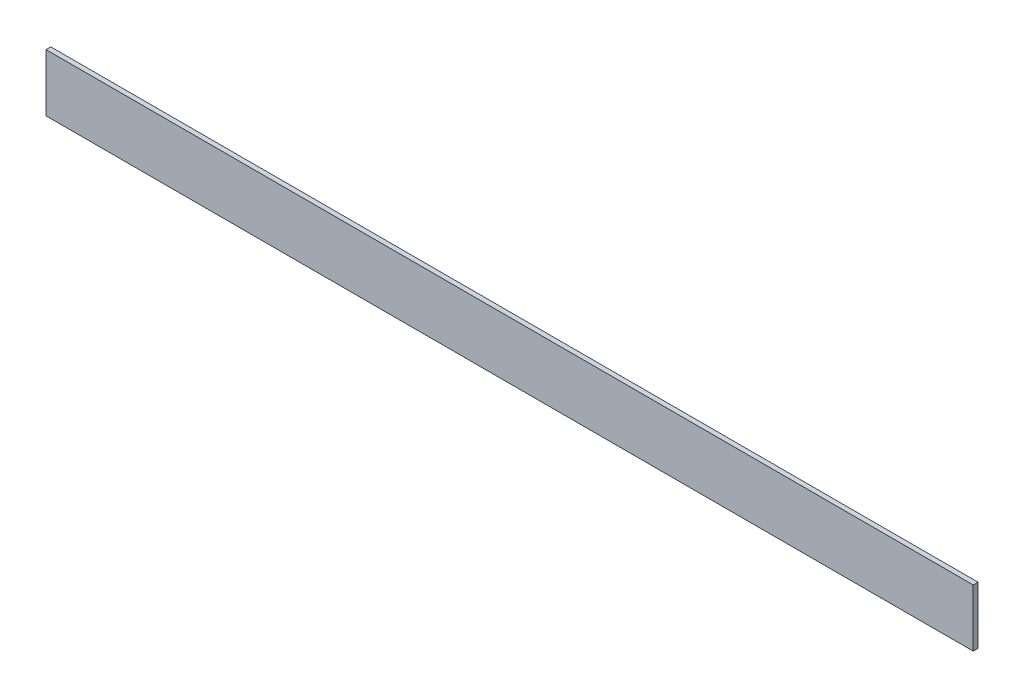
ISO-10303-21;
HEADER;
FILE_DESCRIPTION(('STEP AP214'),'2;1');
FILE_NAME('part.step','',(''),(''),'','','');
FILE_SCHEMA(('AUTOMOTIVE_DESIGN { 1 0 10303 214 1 1 1 1 }'));
ENDSEC;
DATA;
#1=APPLICATION_CONTEXT('core data for automotive mechanical design processes');
#2=APPLICATION_PROTOCOL_DEFINITION('international standard','automotive_design',2000,#1);
#3=PRODUCT_CONTEXT('',#1,'mechanical');
#4=PRODUCT('Part','Part','',(#3));
#5=PRODUCT_RELATED_PRODUCT_CATEGORY('part','',(#4));
#6=PRODUCT_DEFINITION_FORMATION('','',#4);
#7=PRODUCT_DEFINITION_CONTEXT('part definition',#1,'design');
#8=PRODUCT_DEFINITION('design','',#6,#7);
#9=PRODUCT_DEFINITION_SHAPE('','',#8);
#10=(LENGTH_UNIT() NAMED_UNIT(*) SI_UNIT(.MILLI.,.METRE.));
#11=(NAMED_UNIT(*) PLANE_ANGLE_UNIT() SI_UNIT($,.RADIAN.));
#12=(NAMED_UNIT(*) SI_UNIT($,.STERADIAN.) SOLID_ANGLE_UNIT());
#13=UNCERTAINTY_MEASURE_WITH_UNIT(LENGTH_MEASURE(1.E-05),#10,'distance_accuracy_value','');
#14=(GEOMETRIC_REPRESENTATION_CONTEXT(3) GLOBAL_UNCERTAINTY_ASSIGNED_CONTEXT((#13)) GLOBAL_UNIT_ASSIGNED_CONTEXT((#10,
#11,#12)) REPRESENTATION_CONTEXT('',''));
#15=CARTESIAN_POINT('',(0.,0.,0.));
#16=DIRECTION('',(0.,0.,1.));
#17=DIRECTION('',(1.,0.,0.));
#18=AXIS2_PLACEMENT_3D('',#15,#16,#17);
#19=CARTESIAN_POINT('',(2463.8,-0.01,-0.01));
#20=DIRECTION('',(1.,0.,0.));
#21=DIRECTION('',(0.,1.,0.));
#22=AXIS2_PLACEMENT_3D('',#19,#20,#21);
#23=PLANE('',#22);
#24=DIRECTION('',(0.,1.,0.));
#25=VECTOR('',#24,1.);
#26=CARTESIAN_POINT('',(2463.8,76.2000000000001,12.7));
#27=LINE('',#26,#25);
#28=CARTESIAN_POINT('',(2463.8,0.,12.7));
#29=VERTEX_POINT('',#28);
#30=CARTESIAN_POINT('',(2463.8,152.4,12.7));
#31=VERTEX_POINT('',#30);
#32=EDGE_CURVE('E69',#29,#31,#27,.T.);
#33=ORIENTED_EDGE('',*,*,#32,.F.);
#34=DIRECTION('',(0.,0.,1.));
#35=VECTOR('',#34,1.);
#36=CARTESIAN_POINT('',(2463.8,0.,6.35));
#37=LINE('',#36,#35);
#38=CARTESIAN_POINT('',(2463.8,0.,0.));
#39=VERTEX_POINT('',#38);
#40=EDGE_CURVE('E56',#39,#29,#37,.T.);
#41=ORIENTED_EDGE('',*,*,#40,.F.);
#42=DIRECTION('',(0.,-1.,0.));
#43=VECTOR('',#42,1.);
#44=CARTESIAN_POINT('',(2463.8,76.2000000000001,0.));
#45=LINE('',#44,#43);
#46=CARTESIAN_POINT('',(2463.8,152.4,0.));
#47=VERTEX_POINT('',#46);
#48=EDGE_CURVE('E21',#47,#39,#45,.T.);
#49=ORIENTED_EDGE('',*,*,#48,.F.);
#50=DIRECTION('',(0.,0.,-1.));
#51=VECTOR('',#50,1.);
#52=CARTESIAN_POINT('',(2463.8,152.4,6.35));
#53=LINE('',#52,#51);
#54=EDGE_CURVE('E82',#31,#47,#53,.T.);
#55=ORIENTED_EDGE('',*,*,#54,.F.);
#56=EDGE_LOOP('',(#33,#41,#49,#55));
#57=FACE_BOUND('',#56,.T.);
#58=ADVANCED_FACE('F17',(#57),#23,.T.);
#59=CARTESIAN_POINT('',(2463.81,-0.0100000000000033,0.));
#60=DIRECTION('',(0.,0.,-1.));
#61=DIRECTION('',(-1.,0.,0.));
#62=AXIS2_PLACEMENT_3D('',#59,#60,#61);
#63=PLANE('',#62);
#64=DIRECTION('',(-1.,0.,0.));
#65=VECTOR('',#64,1.);
#66=CARTESIAN_POINT('',(1231.9,152.4,0.));
#67=LINE('',#66,#65);
#68=CARTESIAN_POINT('',(-1.47364097593227E-13,152.4,0.));
#69=VERTEX_POINT('',#68);
#70=EDGE_CURVE('E65',#47,#69,#67,.T.);
#71=ORIENTED_EDGE('',*,*,#70,.F.);
#72=ORIENTED_EDGE('',*,*,#48,.T.);
#73=DIRECTION('',(1.,0.,0.));
#74=VECTOR('',#73,1.);
#75=CARTESIAN_POINT('',(1231.9,0.,0.));
#76=LINE('',#75,#74);
#77=CARTESIAN_POINT('',(-1.96527737388996E-13,0.,0.));
#78=VERTEX_POINT('',#77);
#79=EDGE_CURVE('E62',#78,#39,#76,.T.);
#80=ORIENTED_EDGE('',*,*,#79,.F.);
#81=DIRECTION('',(0.,-1.,0.));
#82=VECTOR('',#81,1.);
#83=CARTESIAN_POINT('',(0.,76.2,0.));
#84=LINE('',#83,#82);
#85=EDGE_CURVE('E84',#69,#78,#84,.T.);
#86=ORIENTED_EDGE('',*,*,#85,.F.);
#87=EDGE_LOOP('',(#71,#72,#80,#86));
#88=FACE_BOUND('',#87,.T.);
#89=ADVANCED_FACE('F61',(#88),#63,.T.);
#90=CARTESIAN_POINT('',(-0.01,0.,-0.01));
#91=DIRECTION('',(0.,-1.,0.));
#92=DIRECTION('',(1.,0.,0.));
#93=AXIS2_PLACEMENT_3D('',#90,#91,#92);
#94=PLANE('',#93);
#95=DIRECTION('',(1.,0.,0.));
#96=VECTOR('',#95,1.);
#97=CARTESIAN_POINT('',(1231.9,0.,12.7));
#98=LINE('',#97,#96);
#99=CARTESIAN_POINT('',(0.,0.,12.7));
#100=VERTEX_POINT('',#99);
#101=EDGE_CURVE('E71',#100,#29,#98,.T.);
#102=ORIENTED_EDGE('',*,*,#101,.F.);
#103=DIRECTION('',(0.,0.,1.));
#104=VECTOR('',#103,1.);
#105=CARTESIAN_POINT('',(0.,0.,6.35));
#106=LINE('',#105,#104);
#107=EDGE_CURVE('E75',#78,#100,#106,.T.);
#108=ORIENTED_EDGE('',*,*,#107,.F.);
#109=ORIENTED_EDGE('',*,*,#79,.T.);
#110=ORIENTED_EDGE('',*,*,#40,.T.);
#111=EDGE_LOOP('',(#102,#108,#109,#110));
#112=FACE_BOUND('',#111,.T.);
#113=ADVANCED_FACE('F73',(#112),#94,.T.);
#114=CARTESIAN_POINT('',(-0.0100000000000478,-0.0100000000000033,12.7));
#115=DIRECTION('',(0.,0.,1.));
#116=DIRECTION('',(1.,0.,0.));
#117=AXIS2_PLACEMENT_3D('',#114,#115,#116);
#118=PLANE('',#117);
#119=DIRECTION('',(1.,0.,0.));
#120=VECTOR('',#119,1.);
#121=CARTESIAN_POINT('',(1231.9,152.4,12.7));
#122=LINE('',#121,#120);
#123=CARTESIAN_POINT('',(0.,152.4,12.7));
#124=VERTEX_POINT('',#123);
#125=EDGE_CURVE('E36',#124,#31,#122,.T.);
#126=ORIENTED_EDGE('',*,*,#125,.F.);
#127=DIRECTION('',(0.,1.,0.));
#128=VECTOR('',#127,1.);
#129=CARTESIAN_POINT('',(0.,76.2,12.7));
#130=LINE('',#129,#128);
#131=EDGE_CURVE('E27',#100,#124,#130,.T.);
#132=ORIENTED_EDGE('',*,*,#131,.F.);
#133=ORIENTED_EDGE('',*,*,#101,.T.);
#134=ORIENTED_EDGE('',*,*,#32,.T.);
#135=EDGE_LOOP('',(#126,#132,#133,#134));
#136=FACE_BOUND('',#135,.T.);
#137=ADVANCED_FACE('F89',(#136),#118,.T.);
#138=CARTESIAN_POINT('',(2463.81,152.4,-0.01));
#139=DIRECTION('',(0.,1.,0.));
#140=DIRECTION('',(-1.,0.,0.));
#141=AXIS2_PLACEMENT_3D('',#138,#139,#140);
#142=PLANE('',#141);
#143=ORIENTED_EDGE('',*,*,#125,.T.);
#144=ORIENTED_EDGE('',*,*,#54,.T.);
#145=ORIENTED_EDGE('',*,*,#70,.T.);
#146=DIRECTION('',(0.,0.,-1.));
#147=VECTOR('',#146,1.);
#148=CARTESIAN_POINT('',(0.,152.4,6.35));
#149=LINE('',#148,#147);
#150=EDGE_CURVE('E11',#124,#69,#149,.T.);
#151=ORIENTED_EDGE('',*,*,#150,.F.);
#152=EDGE_LOOP('',(#143,#144,#145,#151));
#153=FACE_BOUND('',#152,.T.);
#154=ADVANCED_FACE('F91',(#153),#142,.T.);
#155=CARTESIAN_POINT('',(0.,152.41,-0.01));
#156=DIRECTION('',(-1.,0.,0.));
#157=DIRECTION('',(0.,-1.,0.));
#158=AXIS2_PLACEMENT_3D('',#155,#156,#157);
#159=PLANE('',#158);
#160=ORIENTED_EDGE('',*,*,#131,.T.);
#161=ORIENTED_EDGE('',*,*,#150,.T.);
#162=ORIENTED_EDGE('',*,*,#85,.T.);
#163=ORIENTED_EDGE('',*,*,#107,.T.);
#164=EDGE_LOOP('',(#160,#161,#162,#163));
#165=FACE_BOUND('',#164,.T.);
#166=ADVANCED_FACE('F19',(#165),#159,.T.);
#167=CLOSED_SHELL('',(#58,#89,#113,#137,#154,#166));
#168=MANIFOLD_SOLID_BREP('B1',#167);
#169=ADVANCED_BREP_SHAPE_REPRESENTATION('',(#18,#168),#14);
#170=SHAPE_DEFINITION_REPRESENTATION(#9,#169);
ENDSEC;
END-ISO-10303-21;
